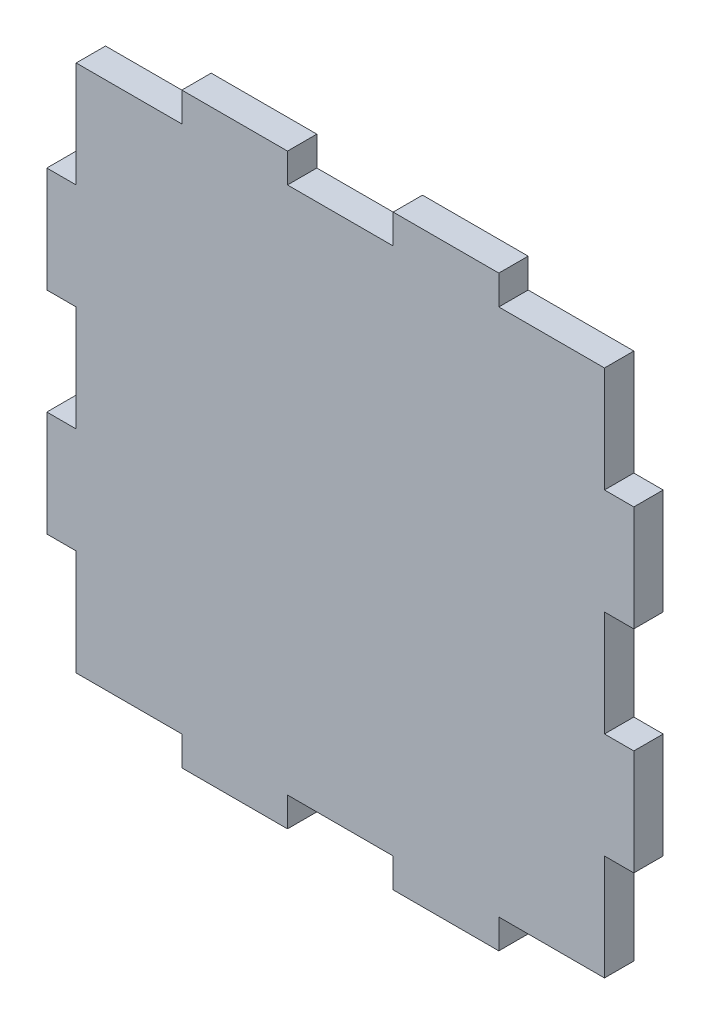
ISO-10303-21;
HEADER;
FILE_DESCRIPTION(('STEP AP214'),'2;1');
FILE_NAME('part.step','',(''),(''),'','','');
FILE_SCHEMA(('AUTOMOTIVE_DESIGN { 1 0 10303 214 1 1 1 1 }'));
ENDSEC;
DATA;
#1=APPLICATION_CONTEXT('core data for automotive mechanical design processes');
#2=APPLICATION_PROTOCOL_DEFINITION('international standard','automotive_design',2000,#1);
#3=PRODUCT_CONTEXT('',#1,'mechanical');
#4=PRODUCT('Part','Part','',(#3));
#5=PRODUCT_RELATED_PRODUCT_CATEGORY('part','',(#4));
#6=PRODUCT_DEFINITION_FORMATION('','',#4);
#7=PRODUCT_DEFINITION_CONTEXT('part definition',#1,'design');
#8=PRODUCT_DEFINITION('design','',#6,#7);
#9=PRODUCT_DEFINITION_SHAPE('','',#8);
#10=(LENGTH_UNIT() NAMED_UNIT(*) SI_UNIT(.MILLI.,.METRE.));
#11=(NAMED_UNIT(*) PLANE_ANGLE_UNIT() SI_UNIT($,.RADIAN.));
#12=(NAMED_UNIT(*) SI_UNIT($,.STERADIAN.) SOLID_ANGLE_UNIT());
#13=UNCERTAINTY_MEASURE_WITH_UNIT(LENGTH_MEASURE(1.E-05),#10,'distance_accuracy_value','');
#14=(GEOMETRIC_REPRESENTATION_CONTEXT(3) GLOBAL_UNCERTAINTY_ASSIGNED_CONTEXT((#13)) GLOBAL_UNIT_ASSIGNED_CONTEXT((#10,
#11,#12)) REPRESENTATION_CONTEXT('',''));
#15=CARTESIAN_POINT('',(0.,0.,0.));
#16=DIRECTION('',(0.,0.,1.));
#17=DIRECTION('',(1.,0.,0.));
#18=AXIS2_PLACEMENT_3D('',#15,#16,#17);
#19=CARTESIAN_POINT('',(0.,-90.,5.));
#20=DIRECTION('',(0.,1.,0.));
#21=DIRECTION('',(0.,0.,1.));
#22=AXIS2_PLACEMENT_3D('',#19,#20,#21);
#23=PLANE('',#22);
#24=DIRECTION('',(1.,0.,0.));
#25=VECTOR('',#24,1.);
#26=CARTESIAN_POINT('',(0.,-90.,5.));
#27=LINE('',#26,#25);
#28=CARTESIAN_POINT('',(-18.,-90.,5.));
#29=VERTEX_POINT('',#28);
#30=CARTESIAN_POINT('',(0.,-90.,5.));
#31=VERTEX_POINT('',#30);
#32=EDGE_CURVE('E48',#29,#31,#27,.T.);
#33=ORIENTED_EDGE('',*,*,#32,.F.);
#34=DIRECTION('',(0.,0.,-1.));
#35=VECTOR('',#34,1.);
#36=CARTESIAN_POINT('',(-18.,-89.9999999999999,5.));
#37=LINE('',#36,#35);
#38=CARTESIAN_POINT('',(-18.,-89.9999999999999,0.));
#39=VERTEX_POINT('',#38);
#40=EDGE_CURVE('E303',#29,#39,#37,.T.);
#41=ORIENTED_EDGE('',*,*,#40,.T.);
#42=DIRECTION('',(1.,0.,0.));
#43=VECTOR('',#42,1.);
#44=CARTESIAN_POINT('',(0.,-90.,0.));
#45=LINE('',#44,#43);
#46=CARTESIAN_POINT('',(0.,-90.,0.));
#47=VERTEX_POINT('',#46);
#48=EDGE_CURVE('E527',#39,#47,#45,.T.);
#49=ORIENTED_EDGE('',*,*,#48,.T.);
#50=DIRECTION('',(0.,0.,-1.));
#51=VECTOR('',#50,1.);
#52=CARTESIAN_POINT('',(0.,-90.,5.));
#53=LINE('',#52,#51);
#54=EDGE_CURVE('E515',#31,#47,#53,.T.);
#55=ORIENTED_EDGE('',*,*,#54,.F.);
#56=EDGE_LOOP('',(#33,#41,#49,#55));
#57=FACE_BOUND('',#56,.T.);
#58=ADVANCED_FACE('F33',(#57),#23,.F.);
#59=DIRECTION('',(0.,0.,-1.));
#60=VECTOR('',#59,1.);
#61=CARTESIAN_POINT('',(-72.,-89.9999999999999,5.));
#62=LINE('',#61,#60);
#63=CARTESIAN_POINT('',(-72.,-89.9999999999999,5.));
#64=VERTEX_POINT('',#63);
#65=CARTESIAN_POINT('',(-72.,-89.9999999999999,0.));
#66=VERTEX_POINT('',#65);
#67=EDGE_CURVE('E329',#64,#66,#62,.T.);
#68=ORIENTED_EDGE('',*,*,#67,.F.);
#69=CARTESIAN_POINT('',(-90.,-90.,5.));
#70=VERTEX_POINT('',#69);
#71=EDGE_CURVE('E512',#70,#64,#27,.T.);
#72=ORIENTED_EDGE('',*,*,#71,.F.);
#73=DIRECTION('',(0.,0.,-1.));
#74=VECTOR('',#73,1.);
#75=CARTESIAN_POINT('',(-90.,-90.,5.));
#76=LINE('',#75,#74);
#77=CARTESIAN_POINT('',(-90.,-90.,0.));
#78=VERTEX_POINT('',#77);
#79=EDGE_CURVE('E535',#70,#78,#76,.T.);
#80=ORIENTED_EDGE('',*,*,#79,.T.);
#81=EDGE_CURVE('E529',#78,#66,#45,.T.);
#82=ORIENTED_EDGE('',*,*,#81,.T.);
#83=EDGE_LOOP('',(#68,#72,#80,#82));
#84=FACE_BOUND('',#83,.T.);
#85=ADVANCED_FACE('F620',(#84),#23,.F.);
#86=CARTESIAN_POINT('',(0.,0.,5.));
#87=DIRECTION('',(0.,-1.,0.));
#88=DIRECTION('',(1.,0.,0.));
#89=AXIS2_PLACEMENT_3D('',#86,#87,#88);
#90=PLANE('',#89);
#91=DIRECTION('',(-1.,0.,0.));
#92=VECTOR('',#91,1.);
#93=CARTESIAN_POINT('',(0.,0.,0.));
#94=LINE('',#93,#92);
#95=CARTESIAN_POINT('',(-36.,0.,0.));
#96=VERTEX_POINT('',#95);
#97=CARTESIAN_POINT('',(-54.,0.,0.));
#98=VERTEX_POINT('',#97);
#99=EDGE_CURVE('E524',#96,#98,#94,.T.);
#100=ORIENTED_EDGE('',*,*,#99,.T.);
#101=DIRECTION('',(0.,0.,-1.));
#102=VECTOR('',#101,1.);
#103=CARTESIAN_POINT('',(-54.,0.,5.));
#104=LINE('',#103,#102);
#105=CARTESIAN_POINT('',(-54.,0.,5.));
#106=VERTEX_POINT('',#105);
#107=EDGE_CURVE('E342',#106,#98,#104,.T.);
#108=ORIENTED_EDGE('',*,*,#107,.F.);
#109=DIRECTION('',(-1.,0.,0.));
#110=VECTOR('',#109,1.);
#111=CARTESIAN_POINT('',(0.,0.,5.));
#112=LINE('',#111,#110);
#113=CARTESIAN_POINT('',(-36.,0.,5.));
#114=VERTEX_POINT('',#113);
#115=EDGE_CURVE('E507',#114,#106,#112,.T.);
#116=ORIENTED_EDGE('',*,*,#115,.F.);
#117=DIRECTION('',(0.,0.,-1.));
#118=VECTOR('',#117,1.);
#119=CARTESIAN_POINT('',(-36.,0.,5.));
#120=LINE('',#119,#118);
#121=EDGE_CURVE('E382',#114,#96,#120,.T.);
#122=ORIENTED_EDGE('',*,*,#121,.T.);
#123=EDGE_LOOP('',(#100,#108,#116,#122));
#124=FACE_BOUND('',#123,.T.);
#125=ADVANCED_FACE('F573',(#124),#90,.F.);
#126=DIRECTION('',(0.,0.,-1.));
#127=VECTOR('',#126,1.);
#128=CARTESIAN_POINT('',(-18.,0.,5.));
#129=LINE('',#128,#127);
#130=CARTESIAN_POINT('',(-18.,0.,5.));
#131=VERTEX_POINT('',#130);
#132=CARTESIAN_POINT('',(-18.,0.,0.));
#133=VERTEX_POINT('',#132);
#134=EDGE_CURVE('E369',#131,#133,#129,.T.);
#135=ORIENTED_EDGE('',*,*,#134,.F.);
#136=CARTESIAN_POINT('',(0.,0.,5.));
#137=VERTEX_POINT('',#136);
#138=EDGE_CURVE('E503',#137,#131,#112,.T.);
#139=ORIENTED_EDGE('',*,*,#138,.F.);
#140=DIRECTION('',(0.,0.,-1.));
#141=VECTOR('',#140,1.);
#142=CARTESIAN_POINT('',(0.,0.,5.));
#143=LINE('',#142,#141);
#144=CARTESIAN_POINT('',(0.,0.,0.));
#145=VERTEX_POINT('',#144);
#146=EDGE_CURVE('E11',#137,#145,#143,.T.);
#147=ORIENTED_EDGE('',*,*,#146,.T.);
#148=EDGE_CURVE('E520',#145,#133,#94,.T.);
#149=ORIENTED_EDGE('',*,*,#148,.T.);
#150=EDGE_LOOP('',(#135,#139,#147,#149));
#151=FACE_BOUND('',#150,.T.);
#152=ADVANCED_FACE('F586',(#151),#90,.F.);
#153=CARTESIAN_POINT('',(-90.,0.,5.));
#154=DIRECTION('',(1.,0.,0.));
#155=DIRECTION('',(0.,0.,-1.));
#156=AXIS2_PLACEMENT_3D('',#153,#154,#155);
#157=PLANE('',#156);
#158=DIRECTION('',(0.,-1.,0.));
#159=VECTOR('',#158,1.);
#160=CARTESIAN_POINT('',(-90.,0.,0.));
#161=LINE('',#160,#159);
#162=CARTESIAN_POINT('',(-90.,0.,0.));
#163=VERTEX_POINT('',#162);
#164=CARTESIAN_POINT('',(-90.,-17.9999999999999,0.));
#165=VERTEX_POINT('',#164);
#166=EDGE_CURVE('E525',#163,#165,#161,.T.);
#167=ORIENTED_EDGE('',*,*,#166,.T.);
#168=DIRECTION('',(0.,0.,-1.));
#169=VECTOR('',#168,1.);
#170=CARTESIAN_POINT('',(-90.,-18.,5.));
#171=LINE('',#170,#169);
#172=CARTESIAN_POINT('',(-90.,-17.9999999999999,5.));
#173=VERTEX_POINT('',#172);
#174=EDGE_CURVE('E396',#173,#165,#171,.T.);
#175=ORIENTED_EDGE('',*,*,#174,.F.);
#176=DIRECTION('',(0.,-1.,0.));
#177=VECTOR('',#176,1.);
#178=CARTESIAN_POINT('',(-90.,0.,5.));
#179=LINE('',#178,#177);
#180=CARTESIAN_POINT('',(-90.,0.,5.));
#181=VERTEX_POINT('',#180);
#182=EDGE_CURVE('E508',#181,#173,#179,.T.);
#183=ORIENTED_EDGE('',*,*,#182,.F.);
#184=DIRECTION('',(0.,0.,-1.));
#185=VECTOR('',#184,1.);
#186=CARTESIAN_POINT('',(-90.,0.,5.));
#187=LINE('',#186,#185);
#188=EDGE_CURVE('E41',#181,#163,#187,.T.);
#189=ORIENTED_EDGE('',*,*,#188,.T.);
#190=EDGE_LOOP('',(#167,#175,#183,#189));
#191=FACE_BOUND('',#190,.T.);
#192=ADVANCED_FACE('F542',(#191),#157,.F.);
#193=CARTESIAN_POINT('',(-90.,-35.9999999999999,5.));
#194=VERTEX_POINT('',#193);
#195=CARTESIAN_POINT('',(-90.,-53.9999999999999,5.));
#196=VERTEX_POINT('',#195);
#197=EDGE_CURVE('E511',#194,#196,#179,.T.);
#198=ORIENTED_EDGE('',*,*,#197,.F.);
#199=DIRECTION('',(0.,0.,-1.));
#200=VECTOR('',#199,1.);
#201=CARTESIAN_POINT('',(-90.,-35.9999999999999,5.));
#202=LINE('',#201,#200);
#203=CARTESIAN_POINT('',(-90.,-35.9999999999999,0.));
#204=VERTEX_POINT('',#203);
#205=EDGE_CURVE('E409',#194,#204,#202,.T.);
#206=ORIENTED_EDGE('',*,*,#205,.T.);
#207=CARTESIAN_POINT('',(-90.,-53.9999999999999,0.));
#208=VERTEX_POINT('',#207);
#209=EDGE_CURVE('E528',#204,#208,#161,.T.);
#210=ORIENTED_EDGE('',*,*,#209,.T.);
#211=DIRECTION('',(0.,0.,-1.));
#212=VECTOR('',#211,1.);
#213=CARTESIAN_POINT('',(-90.,-53.9999999999999,5.));
#214=LINE('',#213,#212);
#215=EDGE_CURVE('E424',#196,#208,#214,.T.);
#216=ORIENTED_EDGE('',*,*,#215,.F.);
#217=EDGE_LOOP('',(#198,#206,#210,#216));
#218=FACE_BOUND('',#217,.T.);
#219=ADVANCED_FACE('F640',(#218),#157,.F.);
#220=CARTESIAN_POINT('',(0.,0.,5.));
#221=DIRECTION('',(-1.,0.,0.));
#222=DIRECTION('',(0.,0.,1.));
#223=AXIS2_PLACEMENT_3D('',#220,#221,#222);
#224=PLANE('',#223);
#225=DIRECTION('',(0.,1.,0.));
#226=VECTOR('',#225,1.);
#227=CARTESIAN_POINT('',(0.,0.,5.));
#228=LINE('',#227,#226);
#229=CARTESIAN_POINT('',(0.,-54.,5.));
#230=VERTEX_POINT('',#229);
#231=CARTESIAN_POINT('',(0.,-36.,5.));
#232=VERTEX_POINT('',#231);
#233=EDGE_CURVE('E501',#230,#232,#228,.T.);
#234=ORIENTED_EDGE('',*,*,#233,.F.);
#235=DIRECTION('',(0.,0.,-1.));
#236=VECTOR('',#235,1.);
#237=CARTESIAN_POINT('',(0.,-54.,5.));
#238=LINE('',#237,#236);
#239=CARTESIAN_POINT('',(0.,-54.,0.));
#240=VERTEX_POINT('',#239);
#241=EDGE_CURVE('E463',#230,#240,#238,.T.);
#242=ORIENTED_EDGE('',*,*,#241,.T.);
#243=DIRECTION('',(0.,1.,0.));
#244=VECTOR('',#243,1.);
#245=CARTESIAN_POINT('',(0.,0.,0.));
#246=LINE('',#245,#244);
#247=CARTESIAN_POINT('',(0.,-36.,0.));
#248=VERTEX_POINT('',#247);
#249=EDGE_CURVE('E519',#240,#248,#246,.T.);
#250=ORIENTED_EDGE('',*,*,#249,.T.);
#251=DIRECTION('',(0.,0.,-1.));
#252=VECTOR('',#251,1.);
#253=CARTESIAN_POINT('',(0.,-36.,5.));
#254=LINE('',#253,#252);
#255=EDGE_CURVE('E494',#232,#248,#254,.T.);
#256=ORIENTED_EDGE('',*,*,#255,.F.);
#257=EDGE_LOOP('',(#234,#242,#250,#256));
#258=FACE_BOUND('',#257,.T.);
#259=ADVANCED_FACE('F593',(#258),#224,.F.);
#260=CARTESIAN_POINT('',(0.,-72.,0.));
#261=VERTEX_POINT('',#260);
#262=EDGE_CURVE('E516',#47,#261,#246,.T.);
#263=ORIENTED_EDGE('',*,*,#262,.T.);
#264=DIRECTION('',(0.,0.,-1.));
#265=VECTOR('',#264,1.);
#266=CARTESIAN_POINT('',(0.,-72.,5.));
#267=LINE('',#266,#265);
#268=CARTESIAN_POINT('',(0.,-72.,5.));
#269=VERTEX_POINT('',#268);
#270=EDGE_CURVE('E466',#269,#261,#267,.T.);
#271=ORIENTED_EDGE('',*,*,#270,.F.);
#272=EDGE_CURVE('E498',#31,#269,#228,.T.);
#273=ORIENTED_EDGE('',*,*,#272,.F.);
#274=ORIENTED_EDGE('',*,*,#54,.T.);
#275=EDGE_LOOP('',(#263,#271,#273,#274));
#276=FACE_BOUND('',#275,.T.);
#277=ADVANCED_FACE('F648',(#276),#224,.F.);
#278=CARTESIAN_POINT('',(0.,-18.,5.));
#279=VERTEX_POINT('',#278);
#280=EDGE_CURVE('E502',#279,#137,#228,.T.);
#281=ORIENTED_EDGE('',*,*,#280,.F.);
#282=DIRECTION('',(0.,0.,-1.));
#283=VECTOR('',#282,1.);
#284=CARTESIAN_POINT('',(0.,-18.,5.));
#285=LINE('',#284,#283);
#286=CARTESIAN_POINT('',(0.,-18.,0.));
#287=VERTEX_POINT('',#286);
#288=EDGE_CURVE('E491',#279,#287,#285,.T.);
#289=ORIENTED_EDGE('',*,*,#288,.T.);
#290=EDGE_CURVE('E490',#287,#145,#246,.T.);
#291=ORIENTED_EDGE('',*,*,#290,.T.);
#292=ORIENTED_EDGE('',*,*,#146,.F.);
#293=EDGE_LOOP('',(#281,#289,#291,#292));
#294=FACE_BOUND('',#293,.T.);
#295=ADVANCED_FACE('F35',(#294),#224,.F.);
#296=CARTESIAN_POINT('',(-72.,0.,5.));
#297=VERTEX_POINT('',#296);
#298=EDGE_CURVE('E500',#297,#181,#112,.T.);
#299=ORIENTED_EDGE('',*,*,#298,.F.);
#300=DIRECTION('',(0.,0.,-1.));
#301=VECTOR('',#300,1.);
#302=CARTESIAN_POINT('',(-72.,0.,5.));
#303=LINE('',#302,#301);
#304=CARTESIAN_POINT('',(-72.,0.,0.));
#305=VERTEX_POINT('',#304);
#306=EDGE_CURVE('E355',#297,#305,#303,.T.);
#307=ORIENTED_EDGE('',*,*,#306,.T.);
#308=EDGE_CURVE('E518',#305,#163,#94,.T.);
#309=ORIENTED_EDGE('',*,*,#308,.T.);
#310=ORIENTED_EDGE('',*,*,#188,.F.);
#311=EDGE_LOOP('',(#299,#307,#309,#310));
#312=FACE_BOUND('',#311,.T.);
#313=ADVANCED_FACE('F571',(#312),#90,.F.);
#314=CARTESIAN_POINT('',(-90.,-71.9999999999999,5.));
#315=VERTEX_POINT('',#314);
#316=EDGE_CURVE('E506',#315,#70,#179,.T.);
#317=ORIENTED_EDGE('',*,*,#316,.F.);
#318=DIRECTION('',(0.,0.,-1.));
#319=VECTOR('',#318,1.);
#320=CARTESIAN_POINT('',(-90.,-71.9999999999999,5.));
#321=LINE('',#320,#319);
#322=CARTESIAN_POINT('',(-90.,-71.9999999999999,0.));
#323=VERTEX_POINT('',#322);
#324=EDGE_CURVE('E437',#315,#323,#321,.T.);
#325=ORIENTED_EDGE('',*,*,#324,.T.);
#326=EDGE_CURVE('E523',#323,#78,#161,.T.);
#327=ORIENTED_EDGE('',*,*,#326,.T.);
#328=ORIENTED_EDGE('',*,*,#79,.F.);
#329=EDGE_LOOP('',(#317,#325,#327,#328));
#330=FACE_BOUND('',#329,.T.);
#331=ADVANCED_FACE('F631',(#330),#157,.F.);
#332=CARTESIAN_POINT('',(-54.,-90.,0.));
#333=VERTEX_POINT('',#332);
#334=CARTESIAN_POINT('',(-36.,-90.,0.));
#335=VERTEX_POINT('',#334);
#336=EDGE_CURVE('E532',#333,#335,#45,.T.);
#337=ORIENTED_EDGE('',*,*,#336,.T.);
#338=DIRECTION('',(0.,0.,-1.));
#339=VECTOR('',#338,1.);
#340=CARTESIAN_POINT('',(-36.,-89.9999999999999,5.));
#341=LINE('',#340,#339);
#342=CARTESIAN_POINT('',(-36.,-90.,5.));
#343=VERTEX_POINT('',#342);
#344=EDGE_CURVE('E56',#343,#335,#341,.T.);
#345=ORIENTED_EDGE('',*,*,#344,.F.);
#346=CARTESIAN_POINT('',(-54.,-89.9999999999999,5.));
#347=VERTEX_POINT('',#346);
#348=EDGE_CURVE('E288',#347,#343,#27,.T.);
#349=ORIENTED_EDGE('',*,*,#348,.F.);
#350=DIRECTION('',(0.,0.,-1.));
#351=VECTOR('',#350,1.);
#352=CARTESIAN_POINT('',(-54.,-89.9999999999999,5.));
#353=LINE('',#352,#351);
#354=EDGE_CURVE('E326',#347,#333,#353,.T.);
#355=ORIENTED_EDGE('',*,*,#354,.T.);
#356=EDGE_LOOP('',(#337,#345,#349,#355));
#357=FACE_BOUND('',#356,.T.);
#358=ADVANCED_FACE('F622',(#357),#23,.F.);
#359=CARTESIAN_POINT('',(0.,0.,5.));
#360=DIRECTION('',(0.,0.,-1.));
#361=DIRECTION('',(-1.,0.,0.));
#362=AXIS2_PLACEMENT_3D('',#359,#360,#361);
#363=PLANE('',#362);
#364=ORIENTED_EDGE('',*,*,#272,.T.);
#365=DIRECTION('',(-1.,0.,0.));
#366=VECTOR('',#365,1.);
#367=CARTESIAN_POINT('',(5.00000000000035,-72.,5.));
#368=LINE('',#367,#366);
#369=CARTESIAN_POINT('',(5.00000000000035,-72.,5.));
#370=VERTEX_POINT('',#369);
#371=EDGE_CURVE('E445',#370,#269,#368,.T.);
#372=ORIENTED_EDGE('',*,*,#371,.F.);
#373=DIRECTION('',(0.,-1.,0.));
#374=VECTOR('',#373,1.);
#375=CARTESIAN_POINT('',(5.00000000000035,-54.,5.));
#376=LINE('',#375,#374);
#377=CARTESIAN_POINT('',(5.00000000000035,-54.,5.));
#378=VERTEX_POINT('',#377);
#379=EDGE_CURVE('E442',#378,#370,#376,.T.);
#380=ORIENTED_EDGE('',*,*,#379,.F.);
#381=DIRECTION('',(1.,0.,0.));
#382=VECTOR('',#381,1.);
#383=CARTESIAN_POINT('',(5.00000000000035,-54.,5.));
#384=LINE('',#383,#382);
#385=EDGE_CURVE('E449',#230,#378,#384,.T.);
#386=ORIENTED_EDGE('',*,*,#385,.F.);
#387=ORIENTED_EDGE('',*,*,#233,.T.);
#388=DIRECTION('',(-1.,0.,0.));
#389=VECTOR('',#388,1.);
#390=CARTESIAN_POINT('',(5.00000000000035,-36.,5.));
#391=LINE('',#390,#389);
#392=CARTESIAN_POINT('',(5.00000000000035,-36.,5.));
#393=VERTEX_POINT('',#392);
#394=EDGE_CURVE('E473',#393,#232,#391,.T.);
#395=ORIENTED_EDGE('',*,*,#394,.F.);
#396=DIRECTION('',(0.,-1.,0.));
#397=VECTOR('',#396,1.);
#398=CARTESIAN_POINT('',(5.00000000000035,-18.,5.));
#399=LINE('',#398,#397);
#400=CARTESIAN_POINT('',(5.00000000000035,-18.,5.));
#401=VERTEX_POINT('',#400);
#402=EDGE_CURVE('E470',#401,#393,#399,.T.);
#403=ORIENTED_EDGE('',*,*,#402,.F.);
#404=DIRECTION('',(1.,0.,0.));
#405=VECTOR('',#404,1.);
#406=CARTESIAN_POINT('',(5.00000000000035,-18.,5.));
#407=LINE('',#406,#405);
#408=EDGE_CURVE('E477',#279,#401,#407,.T.);
#409=ORIENTED_EDGE('',*,*,#408,.F.);
#410=ORIENTED_EDGE('',*,*,#280,.T.);
#411=ORIENTED_EDGE('',*,*,#138,.T.);
#412=DIRECTION('',(0.,-1.,0.));
#413=VECTOR('',#412,1.);
#414=CARTESIAN_POINT('',(-18.,5.00000000000001,5.));
#415=LINE('',#414,#413);
#416=CARTESIAN_POINT('',(-18.,5.00000000000001,5.));
#417=VERTEX_POINT('',#416);
#418=EDGE_CURVE('E360',#417,#131,#415,.T.);
#419=ORIENTED_EDGE('',*,*,#418,.F.);
#420=DIRECTION('',(1.,0.,0.));
#421=VECTOR('',#420,1.);
#422=CARTESIAN_POINT('',(-18.,5.00000000000001,5.));
#423=LINE('',#422,#421);
#424=CARTESIAN_POINT('',(-36.,5.00000000000001,5.));
#425=VERTEX_POINT('',#424);
#426=EDGE_CURVE('E366',#425,#417,#423,.T.);
#427=ORIENTED_EDGE('',*,*,#426,.F.);
#428=DIRECTION('',(0.,1.,0.));
#429=VECTOR('',#428,1.);
#430=CARTESIAN_POINT('',(-36.,5.00000000000001,5.));
#431=LINE('',#430,#429);
#432=EDGE_CURVE('E362',#114,#425,#431,.T.);
#433=ORIENTED_EDGE('',*,*,#432,.F.);
#434=ORIENTED_EDGE('',*,*,#115,.T.);
#435=DIRECTION('',(0.,-1.,0.));
#436=VECTOR('',#435,1.);
#437=CARTESIAN_POINT('',(-54.,5.00000000000001,5.));
#438=LINE('',#437,#436);
#439=CARTESIAN_POINT('',(-54.,5.00000000000001,5.));
#440=VERTEX_POINT('',#439);
#441=EDGE_CURVE('E332',#440,#106,#438,.T.);
#442=ORIENTED_EDGE('',*,*,#441,.F.);
#443=DIRECTION('',(1.,0.,0.));
#444=VECTOR('',#443,1.);
#445=CARTESIAN_POINT('',(-54.,5.00000000000001,5.));
#446=LINE('',#445,#444);
#447=CARTESIAN_POINT('',(-72.,5.00000000000001,5.));
#448=VERTEX_POINT('',#447);
#449=EDGE_CURVE('E339',#448,#440,#446,.T.);
#450=ORIENTED_EDGE('',*,*,#449,.F.);
#451=DIRECTION('',(0.,1.,0.));
#452=VECTOR('',#451,1.);
#453=CARTESIAN_POINT('',(-72.,5.00000000000001,5.));
#454=LINE('',#453,#452);
#455=EDGE_CURVE('E335',#297,#448,#454,.T.);
#456=ORIENTED_EDGE('',*,*,#455,.F.);
#457=ORIENTED_EDGE('',*,*,#298,.T.);
#458=ORIENTED_EDGE('',*,*,#182,.T.);
#459=DIRECTION('',(1.,0.,0.));
#460=VECTOR('',#459,1.);
#461=CARTESIAN_POINT('',(-95.0000000000003,-18.,5.));
#462=LINE('',#461,#460);
#463=CARTESIAN_POINT('',(-95.0000000000003,-18.,5.));
#464=VERTEX_POINT('',#463);
#465=EDGE_CURVE('E386',#464,#173,#462,.T.);
#466=ORIENTED_EDGE('',*,*,#465,.F.);
#467=DIRECTION('',(0.,1.,0.));
#468=VECTOR('',#467,1.);
#469=CARTESIAN_POINT('',(-95.0000000000003,-18.,5.));
#470=LINE('',#469,#468);
#471=CARTESIAN_POINT('',(-95.0000000000003,-35.9999999999999,5.));
#472=VERTEX_POINT('',#471);
#473=EDGE_CURVE('E393',#472,#464,#470,.T.);
#474=ORIENTED_EDGE('',*,*,#473,.F.);
#475=DIRECTION('',(-1.,0.,0.));
#476=VECTOR('',#475,1.);
#477=CARTESIAN_POINT('',(-95.0000000000003,-35.9999999999999,5.));
#478=LINE('',#477,#476);
#479=EDGE_CURVE('E389',#194,#472,#478,.T.);
#480=ORIENTED_EDGE('',*,*,#479,.F.);
#481=ORIENTED_EDGE('',*,*,#197,.T.);
#482=DIRECTION('',(1.,0.,0.));
#483=VECTOR('',#482,1.);
#484=CARTESIAN_POINT('',(-95.0000000000003,-53.9999999999999,5.));
#485=LINE('',#484,#483);
#486=CARTESIAN_POINT('',(-95.0000000000003,-53.9999999999999,5.));
#487=VERTEX_POINT('',#486);
#488=EDGE_CURVE('E414',#487,#196,#485,.T.);
#489=ORIENTED_EDGE('',*,*,#488,.F.);
#490=DIRECTION('',(0.,1.,0.));
#491=VECTOR('',#490,1.);
#492=CARTESIAN_POINT('',(-95.0000000000003,-53.9999999999999,5.));
#493=LINE('',#492,#491);
#494=CARTESIAN_POINT('',(-95.0000000000004,-71.9999999999999,5.));
#495=VERTEX_POINT('',#494);
#496=EDGE_CURVE('E421',#495,#487,#493,.T.);
#497=ORIENTED_EDGE('',*,*,#496,.F.);
#498=DIRECTION('',(-1.,0.,0.));
#499=VECTOR('',#498,1.);
#500=CARTESIAN_POINT('',(-95.0000000000004,-71.9999999999999,5.));
#501=LINE('',#500,#499);
#502=EDGE_CURVE('E417',#315,#495,#501,.T.);
#503=ORIENTED_EDGE('',*,*,#502,.F.);
#504=ORIENTED_EDGE('',*,*,#316,.T.);
#505=ORIENTED_EDGE('',*,*,#71,.T.);
#506=DIRECTION('',(0.,1.,0.));
#507=VECTOR('',#506,1.);
#508=CARTESIAN_POINT('',(-72.,-94.9999999999999,5.));
#509=LINE('',#508,#507);
#510=CARTESIAN_POINT('',(-72.,-94.9999999999999,5.));
#511=VERTEX_POINT('',#510);
#512=EDGE_CURVE('E309',#511,#64,#509,.T.);
#513=ORIENTED_EDGE('',*,*,#512,.F.);
#514=DIRECTION('',(-1.,0.,0.));
#515=VECTOR('',#514,1.);
#516=CARTESIAN_POINT('',(-54.,-94.9999999999999,5.));
#517=LINE('',#516,#515);
#518=CARTESIAN_POINT('',(-54.,-94.9999999999999,5.));
#519=VERTEX_POINT('',#518);
#520=EDGE_CURVE('E306',#519,#511,#517,.T.);
#521=ORIENTED_EDGE('',*,*,#520,.F.);
#522=DIRECTION('',(0.,-1.,0.));
#523=VECTOR('',#522,1.);
#524=CARTESIAN_POINT('',(-54.,-94.9999999999999,5.));
#525=LINE('',#524,#523);
#526=EDGE_CURVE('E312',#347,#519,#525,.T.);
#527=ORIENTED_EDGE('',*,*,#526,.F.);
#528=ORIENTED_EDGE('',*,*,#348,.T.);
#529=DIRECTION('',(0.,1.,0.));
#530=VECTOR('',#529,1.);
#531=CARTESIAN_POINT('',(-36.,-94.9999999999999,5.));
#532=LINE('',#531,#530);
#533=CARTESIAN_POINT('',(-36.,-94.9999999999999,5.));
#534=VERTEX_POINT('',#533);
#535=EDGE_CURVE('E271',#534,#343,#532,.T.);
#536=ORIENTED_EDGE('',*,*,#535,.F.);
#537=DIRECTION('',(-1.,0.,0.));
#538=VECTOR('',#537,1.);
#539=CARTESIAN_POINT('',(-18.,-94.9999999999999,5.));
#540=LINE('',#539,#538);
#541=CARTESIAN_POINT('',(-18.,-94.9999999999999,5.));
#542=VERTEX_POINT('',#541);
#543=EDGE_CURVE('E285',#542,#534,#540,.T.);
#544=ORIENTED_EDGE('',*,*,#543,.F.);
#545=DIRECTION('',(0.,-1.,0.));
#546=VECTOR('',#545,1.);
#547=CARTESIAN_POINT('',(-18.,-94.9999999999999,5.));
#548=LINE('',#547,#546);
#549=EDGE_CURVE('E278',#29,#542,#548,.T.);
#550=ORIENTED_EDGE('',*,*,#549,.F.);
#551=ORIENTED_EDGE('',*,*,#32,.T.);
#552=EDGE_LOOP('',(#364,#372,#380,#386,#387,#395,#403,#409,#410,#411,#419,#427,#433,#434,#442,
#450,#456,#457,#458,#466,#474,#480,#481,#489,#497,#503,#504,#505,#513,#521,#527,#528,#536,#544,
#550,#551));
#553=FACE_BOUND('',#552,.T.);
#554=ADVANCED_FACE('F283',(#553),#363,.F.);
#555=CARTESIAN_POINT('',(0.,0.,0.));
#556=DIRECTION('',(0.,0.,-1.));
#557=DIRECTION('',(-1.,0.,0.));
#558=AXIS2_PLACEMENT_3D('',#555,#556,#557);
#559=PLANE('',#558);
#560=ORIENTED_EDGE('',*,*,#262,.F.);
#561=ORIENTED_EDGE('',*,*,#48,.F.);
#562=DIRECTION('',(0.,-1.,0.));
#563=VECTOR('',#562,1.);
#564=CARTESIAN_POINT('',(-18.,-94.9999999999999,0.));
#565=LINE('',#564,#563);
#566=CARTESIAN_POINT('',(-18.,-94.9999999999999,0.));
#567=VERTEX_POINT('',#566);
#568=EDGE_CURVE('E292',#39,#567,#565,.T.);
#569=ORIENTED_EDGE('',*,*,#568,.T.);
#570=DIRECTION('',(-1.,0.,0.));
#571=VECTOR('',#570,1.);
#572=CARTESIAN_POINT('',(-18.,-94.9999999999999,0.));
#573=LINE('',#572,#571);
#574=CARTESIAN_POINT('',(-36.,-94.9999999999999,0.));
#575=VERTEX_POINT('',#574);
#576=EDGE_CURVE('E298',#567,#575,#573,.T.);
#577=ORIENTED_EDGE('',*,*,#576,.T.);
#578=DIRECTION('',(0.,1.,0.));
#579=VECTOR('',#578,1.);
#580=CARTESIAN_POINT('',(-36.,-94.9999999999999,0.));
#581=LINE('',#580,#579);
#582=EDGE_CURVE('E273',#575,#335,#581,.T.);
#583=ORIENTED_EDGE('',*,*,#582,.T.);
#584=ORIENTED_EDGE('',*,*,#336,.F.);
#585=DIRECTION('',(0.,-1.,0.));
#586=VECTOR('',#585,1.);
#587=CARTESIAN_POINT('',(-54.,-94.9999999999999,0.));
#588=LINE('',#587,#586);
#589=CARTESIAN_POINT('',(-54.,-94.9999999999999,0.));
#590=VERTEX_POINT('',#589);
#591=EDGE_CURVE('E310',#333,#590,#588,.T.);
#592=ORIENTED_EDGE('',*,*,#591,.T.);
#593=DIRECTION('',(-1.,0.,0.));
#594=VECTOR('',#593,1.);
#595=CARTESIAN_POINT('',(-54.,-94.9999999999999,0.));
#596=LINE('',#595,#594);
#597=CARTESIAN_POINT('',(-72.,-94.9999999999999,0.));
#598=VERTEX_POINT('',#597);
#599=EDGE_CURVE('E302',#590,#598,#596,.T.);
#600=ORIENTED_EDGE('',*,*,#599,.T.);
#601=DIRECTION('',(0.,1.,0.));
#602=VECTOR('',#601,1.);
#603=CARTESIAN_POINT('',(-72.,-94.9999999999999,0.));
#604=LINE('',#603,#602);
#605=EDGE_CURVE('E318',#598,#66,#604,.T.);
#606=ORIENTED_EDGE('',*,*,#605,.T.);
#607=ORIENTED_EDGE('',*,*,#81,.F.);
#608=ORIENTED_EDGE('',*,*,#326,.F.);
#609=DIRECTION('',(-1.,0.,0.));
#610=VECTOR('',#609,1.);
#611=CARTESIAN_POINT('',(-95.0000000000004,-71.9999999999999,0.));
#612=LINE('',#611,#610);
#613=CARTESIAN_POINT('',(-95.0000000000004,-71.9999999999999,0.));
#614=VERTEX_POINT('',#613);
#615=EDGE_CURVE('E427',#323,#614,#612,.T.);
#616=ORIENTED_EDGE('',*,*,#615,.T.);
#617=DIRECTION('',(0.,1.,0.));
#618=VECTOR('',#617,1.);
#619=CARTESIAN_POINT('',(-95.0000000000003,-53.9999999999999,0.));
#620=LINE('',#619,#618);
#621=CARTESIAN_POINT('',(-95.0000000000003,-53.9999999999999,0.));
#622=VERTEX_POINT('',#621);
#623=EDGE_CURVE('E418',#614,#622,#620,.T.);
#624=ORIENTED_EDGE('',*,*,#623,.T.);
#625=DIRECTION('',(1.,0.,0.));
#626=VECTOR('',#625,1.);
#627=CARTESIAN_POINT('',(-95.0000000000003,-53.9999999999999,0.));
#628=LINE('',#627,#626);
#629=EDGE_CURVE('E406',#622,#208,#628,.T.);
#630=ORIENTED_EDGE('',*,*,#629,.T.);
#631=ORIENTED_EDGE('',*,*,#209,.F.);
#632=DIRECTION('',(-1.,0.,0.));
#633=VECTOR('',#632,1.);
#634=CARTESIAN_POINT('',(-95.0000000000003,-35.9999999999999,0.));
#635=LINE('',#634,#633);
#636=CARTESIAN_POINT('',(-95.0000000000003,-35.9999999999999,0.));
#637=VERTEX_POINT('',#636);
#638=EDGE_CURVE('E399',#204,#637,#635,.T.);
#639=ORIENTED_EDGE('',*,*,#638,.T.);
#640=DIRECTION('',(0.,1.,0.));
#641=VECTOR('',#640,1.);
#642=CARTESIAN_POINT('',(-95.0000000000003,-18.,0.));
#643=LINE('',#642,#641);
#644=CARTESIAN_POINT('',(-95.0000000000003,-18.,0.));
#645=VERTEX_POINT('',#644);
#646=EDGE_CURVE('E390',#637,#645,#643,.T.);
#647=ORIENTED_EDGE('',*,*,#646,.T.);
#648=DIRECTION('',(1.,0.,0.));
#649=VECTOR('',#648,1.);
#650=CARTESIAN_POINT('',(-95.0000000000003,-18.,0.));
#651=LINE('',#650,#649);
#652=EDGE_CURVE('E379',#645,#165,#651,.T.);
#653=ORIENTED_EDGE('',*,*,#652,.T.);
#654=ORIENTED_EDGE('',*,*,#166,.F.);
#655=ORIENTED_EDGE('',*,*,#308,.F.);
#656=DIRECTION('',(0.,1.,0.));
#657=VECTOR('',#656,1.);
#658=CARTESIAN_POINT('',(-72.,5.00000000000001,0.));
#659=LINE('',#658,#657);
#660=CARTESIAN_POINT('',(-72.,5.00000000000001,0.));
#661=VERTEX_POINT('',#660);
#662=EDGE_CURVE('E345',#305,#661,#659,.T.);
#663=ORIENTED_EDGE('',*,*,#662,.T.);
#664=DIRECTION('',(1.,0.,0.));
#665=VECTOR('',#664,1.);
#666=CARTESIAN_POINT('',(-54.,5.00000000000001,0.));
#667=LINE('',#666,#665);
#668=CARTESIAN_POINT('',(-54.,5.00000000000001,0.));
#669=VERTEX_POINT('',#668);
#670=EDGE_CURVE('E336',#661,#669,#667,.T.);
#671=ORIENTED_EDGE('',*,*,#670,.T.);
#672=DIRECTION('',(0.,-1.,0.));
#673=VECTOR('',#672,1.);
#674=CARTESIAN_POINT('',(-54.,5.00000000000001,0.));
#675=LINE('',#674,#673);
#676=EDGE_CURVE('E325',#669,#98,#675,.T.);
#677=ORIENTED_EDGE('',*,*,#676,.T.);
#678=ORIENTED_EDGE('',*,*,#99,.F.);
#679=DIRECTION('',(0.,1.,0.));
#680=VECTOR('',#679,1.);
#681=CARTESIAN_POINT('',(-36.,5.00000000000001,0.));
#682=LINE('',#681,#680);
#683=CARTESIAN_POINT('',(-36.,5.00000000000001,0.));
#684=VERTEX_POINT('',#683);
#685=EDGE_CURVE('E372',#96,#684,#682,.T.);
#686=ORIENTED_EDGE('',*,*,#685,.T.);
#687=DIRECTION('',(1.,0.,0.));
#688=VECTOR('',#687,1.);
#689=CARTESIAN_POINT('',(-18.,5.00000000000001,0.));
#690=LINE('',#689,#688);
#691=CARTESIAN_POINT('',(-18.,5.00000000000001,0.));
#692=VERTEX_POINT('',#691);
#693=EDGE_CURVE('E363',#684,#692,#690,.T.);
#694=ORIENTED_EDGE('',*,*,#693,.T.);
#695=DIRECTION('',(0.,-1.,0.));
#696=VECTOR('',#695,1.);
#697=CARTESIAN_POINT('',(-18.,5.00000000000001,0.));
#698=LINE('',#697,#696);
#699=EDGE_CURVE('E352',#692,#133,#698,.T.);
#700=ORIENTED_EDGE('',*,*,#699,.T.);
#701=ORIENTED_EDGE('',*,*,#148,.F.);
#702=ORIENTED_EDGE('',*,*,#290,.F.);
#703=DIRECTION('',(1.,0.,0.));
#704=VECTOR('',#703,1.);
#705=CARTESIAN_POINT('',(5.00000000000035,-18.,0.));
#706=LINE('',#705,#704);
#707=CARTESIAN_POINT('',(5.00000000000035,-18.,0.));
#708=VERTEX_POINT('',#707);
#709=EDGE_CURVE('E474',#287,#708,#706,.T.);
#710=ORIENTED_EDGE('',*,*,#709,.T.);
#711=DIRECTION('',(0.,-1.,0.));
#712=VECTOR('',#711,1.);
#713=CARTESIAN_POINT('',(5.00000000000035,-18.,0.));
#714=LINE('',#713,#712);
#715=CARTESIAN_POINT('',(5.00000000000035,-36.,0.));
#716=VERTEX_POINT('',#715);
#717=EDGE_CURVE('E462',#708,#716,#714,.T.);
#718=ORIENTED_EDGE('',*,*,#717,.T.);
#719=DIRECTION('',(-1.,0.,0.));
#720=VECTOR('',#719,1.);
#721=CARTESIAN_POINT('',(5.00000000000035,-36.,0.));
#722=LINE('',#721,#720);
#723=EDGE_CURVE('E483',#716,#248,#722,.T.);
#724=ORIENTED_EDGE('',*,*,#723,.T.);
#725=ORIENTED_EDGE('',*,*,#249,.F.);
#726=DIRECTION('',(1.,0.,0.));
#727=VECTOR('',#726,1.);
#728=CARTESIAN_POINT('',(5.00000000000035,-54.,0.));
#729=LINE('',#728,#727);
#730=CARTESIAN_POINT('',(5.00000000000035,-54.,0.));
#731=VERTEX_POINT('',#730);
#732=EDGE_CURVE('E446',#240,#731,#729,.T.);
#733=ORIENTED_EDGE('',*,*,#732,.T.);
#734=DIRECTION('',(0.,-1.,0.));
#735=VECTOR('',#734,1.);
#736=CARTESIAN_POINT('',(5.00000000000035,-54.,0.));
#737=LINE('',#736,#735);
#738=CARTESIAN_POINT('',(5.00000000000035,-72.,0.));
#739=VERTEX_POINT('',#738);
#740=EDGE_CURVE('E434',#731,#739,#737,.T.);
#741=ORIENTED_EDGE('',*,*,#740,.T.);
#742=DIRECTION('',(-1.,0.,0.));
#743=VECTOR('',#742,1.);
#744=CARTESIAN_POINT('',(5.00000000000035,-72.,0.));
#745=LINE('',#744,#743);
#746=EDGE_CURVE('E455',#739,#261,#745,.T.);
#747=ORIENTED_EDGE('',*,*,#746,.T.);
#748=EDGE_LOOP('',(#560,#561,#569,#577,#583,#584,#592,#600,#606,#607,#608,#616,#624,#630,#631,
#639,#647,#653,#654,#655,#663,#671,#677,#678,#686,#694,#700,#701,#702,#710,#718,#724,#725,#733,
#741,#747));
#749=FACE_BOUND('',#748,.T.);
#750=ADVANCED_FACE('F546',(#749),#559,.T.);
#751=CARTESIAN_POINT('',(5.00000000000035,-18.,5.));
#752=DIRECTION('',(1.,0.,0.));
#753=DIRECTION('',(0.,0.,-1.));
#754=AXIS2_PLACEMENT_3D('',#751,#752,#753);
#755=PLANE('',#754);
#756=ORIENTED_EDGE('',*,*,#717,.F.);
#757=DIRECTION('',(0.,0.,-1.));
#758=VECTOR('',#757,1.);
#759=CARTESIAN_POINT('',(5.00000000000035,-18.,5.));
#760=LINE('',#759,#758);
#761=EDGE_CURVE('E488',#401,#708,#760,.T.);
#762=ORIENTED_EDGE('',*,*,#761,.F.);
#763=ORIENTED_EDGE('',*,*,#402,.T.);
#764=DIRECTION('',(0.,0.,-1.));
#765=VECTOR('',#764,1.);
#766=CARTESIAN_POINT('',(5.00000000000035,-36.,5.));
#767=LINE('',#766,#765);
#768=EDGE_CURVE('E480',#393,#716,#767,.T.);
#769=ORIENTED_EDGE('',*,*,#768,.T.);
#770=EDGE_LOOP('',(#756,#762,#763,#769));
#771=FACE_BOUND('',#770,.T.);
#772=ADVANCED_FACE('F602',(#771),#755,.T.);
#773=CARTESIAN_POINT('',(5.00000000000035,-18.,5.));
#774=DIRECTION('',(0.,1.,0.));
#775=DIRECTION('',(0.,0.,1.));
#776=AXIS2_PLACEMENT_3D('',#773,#774,#775);
#777=PLANE('',#776);
#778=ORIENTED_EDGE('',*,*,#709,.F.);
#779=ORIENTED_EDGE('',*,*,#288,.F.);
#780=ORIENTED_EDGE('',*,*,#408,.T.);
#781=ORIENTED_EDGE('',*,*,#761,.T.);
#782=EDGE_LOOP('',(#778,#779,#780,#781));
#783=FACE_BOUND('',#782,.T.);
#784=ADVANCED_FACE('F608',(#783),#777,.T.);
#785=CARTESIAN_POINT('',(5.00000000000035,-36.,5.));
#786=DIRECTION('',(0.,-1.,0.));
#787=DIRECTION('',(0.,0.,-1.));
#788=AXIS2_PLACEMENT_3D('',#785,#786,#787);
#789=PLANE('',#788);
#790=ORIENTED_EDGE('',*,*,#723,.F.);
#791=ORIENTED_EDGE('',*,*,#768,.F.);
#792=ORIENTED_EDGE('',*,*,#394,.T.);
#793=ORIENTED_EDGE('',*,*,#255,.T.);
#794=EDGE_LOOP('',(#790,#791,#792,#793));
#795=FACE_BOUND('',#794,.T.);
#796=ADVANCED_FACE('F598',(#795),#789,.T.);
#797=CARTESIAN_POINT('',(5.00000000000035,-54.,5.));
#798=DIRECTION('',(1.,0.,0.));
#799=DIRECTION('',(0.,0.,-1.));
#800=AXIS2_PLACEMENT_3D('',#797,#798,#799);
#801=PLANE('',#800);
#802=ORIENTED_EDGE('',*,*,#740,.F.);
#803=DIRECTION('',(0.,0.,-1.));
#804=VECTOR('',#803,1.);
#805=CARTESIAN_POINT('',(5.00000000000035,-54.,5.));
#806=LINE('',#805,#804);
#807=EDGE_CURVE('E460',#378,#731,#806,.T.);
#808=ORIENTED_EDGE('',*,*,#807,.F.);
#809=ORIENTED_EDGE('',*,*,#379,.T.);
#810=DIRECTION('',(0.,0.,-1.));
#811=VECTOR('',#810,1.);
#812=CARTESIAN_POINT('',(5.00000000000035,-72.,5.));
#813=LINE('',#812,#811);
#814=EDGE_CURVE('E452',#370,#739,#813,.T.);
#815=ORIENTED_EDGE('',*,*,#814,.T.);
#816=EDGE_LOOP('',(#802,#808,#809,#815));
#817=FACE_BOUND('',#816,.T.);
#818=ADVANCED_FACE('F615',(#817),#801,.T.);
#819=CARTESIAN_POINT('',(5.00000000000035,-54.,5.));
#820=DIRECTION('',(0.,1.,0.));
#821=DIRECTION('',(0.,0.,1.));
#822=AXIS2_PLACEMENT_3D('',#819,#820,#821);
#823=PLANE('',#822);
#824=ORIENTED_EDGE('',*,*,#732,.F.);
#825=ORIENTED_EDGE('',*,*,#241,.F.);
#826=ORIENTED_EDGE('',*,*,#385,.T.);
#827=ORIENTED_EDGE('',*,*,#807,.T.);
#828=EDGE_LOOP('',(#824,#825,#826,#827));
#829=FACE_BOUND('',#828,.T.);
#830=ADVANCED_FACE('F655',(#829),#823,.T.);
#831=CARTESIAN_POINT('',(5.00000000000035,-72.,5.));
#832=DIRECTION('',(0.,-1.,0.));
#833=DIRECTION('',(0.,0.,-1.));
#834=AXIS2_PLACEMENT_3D('',#831,#832,#833);
#835=PLANE('',#834);
#836=ORIENTED_EDGE('',*,*,#746,.F.);
#837=ORIENTED_EDGE('',*,*,#814,.F.);
#838=ORIENTED_EDGE('',*,*,#371,.T.);
#839=ORIENTED_EDGE('',*,*,#270,.T.);
#840=EDGE_LOOP('',(#836,#837,#838,#839));
#841=FACE_BOUND('',#840,.T.);
#842=ADVANCED_FACE('F651',(#841),#835,.T.);
#843=CARTESIAN_POINT('',(-95.0000000000003,-53.9999999999999,5.));
#844=DIRECTION('',(0.,1.,0.));
#845=DIRECTION('',(0.,0.,1.));
#846=AXIS2_PLACEMENT_3D('',#843,#844,#845);
#847=PLANE('',#846);
#848=ORIENTED_EDGE('',*,*,#629,.F.);
#849=DIRECTION('',(0.,0.,-1.));
#850=VECTOR('',#849,1.);
#851=CARTESIAN_POINT('',(-95.0000000000003,-53.9999999999999,5.));
#852=LINE('',#851,#850);
#853=EDGE_CURVE('E432',#487,#622,#852,.T.);
#854=ORIENTED_EDGE('',*,*,#853,.F.);
#855=ORIENTED_EDGE('',*,*,#488,.T.);
#856=ORIENTED_EDGE('',*,*,#215,.T.);
#857=EDGE_LOOP('',(#848,#854,#855,#856));
#858=FACE_BOUND('',#857,.T.);
#859=ADVANCED_FACE('F662',(#858),#847,.T.);
#860=CARTESIAN_POINT('',(-95.0000000000003,-53.9999999999999,5.));
#861=DIRECTION('',(-1.,0.,0.));
#862=DIRECTION('',(0.,-1.,0.));
#863=AXIS2_PLACEMENT_3D('',#860,#861,#862);
#864=PLANE('',#863);
#865=ORIENTED_EDGE('',*,*,#623,.F.);
#866=DIRECTION('',(0.,0.,-1.));
#867=VECTOR('',#866,1.);
#868=CARTESIAN_POINT('',(-95.0000000000004,-71.9999999999999,5.));
#869=LINE('',#868,#867);
#870=EDGE_CURVE('E435',#495,#614,#869,.T.);
#871=ORIENTED_EDGE('',*,*,#870,.F.);
#872=ORIENTED_EDGE('',*,*,#496,.T.);
#873=ORIENTED_EDGE('',*,*,#853,.T.);
#874=EDGE_LOOP('',(#865,#871,#872,#873));
#875=FACE_BOUND('',#874,.T.);
#876=ADVANCED_FACE('F667',(#875),#864,.T.);
#877=CARTESIAN_POINT('',(-95.0000000000004,-71.9999999999999,5.));
#878=DIRECTION('',(0.,-1.,0.));
#879=DIRECTION('',(0.,0.,-1.));
#880=AXIS2_PLACEMENT_3D('',#877,#878,#879);
#881=PLANE('',#880);
#882=ORIENTED_EDGE('',*,*,#615,.F.);
#883=ORIENTED_EDGE('',*,*,#324,.F.);
#884=ORIENTED_EDGE('',*,*,#502,.T.);
#885=ORIENTED_EDGE('',*,*,#870,.T.);
#886=EDGE_LOOP('',(#882,#883,#884,#885));
#887=FACE_BOUND('',#886,.T.);
#888=ADVANCED_FACE('F669',(#887),#881,.T.);
#889=CARTESIAN_POINT('',(-95.0000000000003,-18.,5.));
#890=DIRECTION('',(0.,1.,0.));
#891=DIRECTION('',(0.,0.,1.));
#892=AXIS2_PLACEMENT_3D('',#889,#890,#891);
#893=PLANE('',#892);
#894=ORIENTED_EDGE('',*,*,#652,.F.);
#895=DIRECTION('',(0.,0.,-1.));
#896=VECTOR('',#895,1.);
#897=CARTESIAN_POINT('',(-95.0000000000003,-18.,5.));
#898=LINE('',#897,#896);
#899=EDGE_CURVE('E404',#464,#645,#898,.T.);
#900=ORIENTED_EDGE('',*,*,#899,.F.);
#901=ORIENTED_EDGE('',*,*,#465,.T.);
#902=ORIENTED_EDGE('',*,*,#174,.T.);
#903=EDGE_LOOP('',(#894,#900,#901,#902));
#904=FACE_BOUND('',#903,.T.);
#905=ADVANCED_FACE('F550',(#904),#893,.T.);
#906=CARTESIAN_POINT('',(-95.0000000000003,-18.,5.));
#907=DIRECTION('',(-1.,0.,0.));
#908=DIRECTION('',(0.,-1.,0.));
#909=AXIS2_PLACEMENT_3D('',#906,#907,#908);
#910=PLANE('',#909);
#911=ORIENTED_EDGE('',*,*,#646,.F.);
#912=DIRECTION('',(0.,0.,-1.));
#913=VECTOR('',#912,1.);
#914=CARTESIAN_POINT('',(-95.0000000000003,-35.9999999999999,5.));
#915=LINE('',#914,#913);
#916=EDGE_CURVE('E407',#472,#637,#915,.T.);
#917=ORIENTED_EDGE('',*,*,#916,.F.);
#918=ORIENTED_EDGE('',*,*,#473,.T.);
#919=ORIENTED_EDGE('',*,*,#899,.T.);
#920=EDGE_LOOP('',(#911,#917,#918,#919));
#921=FACE_BOUND('',#920,.T.);
#922=ADVANCED_FACE('F678',(#921),#910,.T.);
#923=CARTESIAN_POINT('',(-95.0000000000003,-35.9999999999999,5.));
#924=DIRECTION('',(0.,-1.,0.));
#925=DIRECTION('',(0.,0.,-1.));
#926=AXIS2_PLACEMENT_3D('',#923,#924,#925);
#927=PLANE('',#926);
#928=ORIENTED_EDGE('',*,*,#638,.F.);
#929=ORIENTED_EDGE('',*,*,#205,.F.);
#930=ORIENTED_EDGE('',*,*,#479,.T.);
#931=ORIENTED_EDGE('',*,*,#916,.T.);
#932=EDGE_LOOP('',(#928,#929,#930,#931));
#933=FACE_BOUND('',#932,.T.);
#934=ADVANCED_FACE('F679',(#933),#927,.T.);
#935=CARTESIAN_POINT('',(-18.,5.00000000000001,5.));
#936=DIRECTION('',(1.,0.,0.));
#937=DIRECTION('',(0.,0.,-1.));
#938=AXIS2_PLACEMENT_3D('',#935,#936,#937);
#939=PLANE('',#938);
#940=ORIENTED_EDGE('',*,*,#699,.F.);
#941=DIRECTION('',(0.,0.,-1.));
#942=VECTOR('',#941,1.);
#943=CARTESIAN_POINT('',(-18.,5.00000000000001,5.));
#944=LINE('',#943,#942);
#945=EDGE_CURVE('E377',#417,#692,#944,.T.);
#946=ORIENTED_EDGE('',*,*,#945,.F.);
#947=ORIENTED_EDGE('',*,*,#418,.T.);
#948=ORIENTED_EDGE('',*,*,#134,.T.);
#949=EDGE_LOOP('',(#940,#946,#947,#948));
#950=FACE_BOUND('',#949,.T.);
#951=ADVANCED_FACE('F581',(#950),#939,.T.);
#952=CARTESIAN_POINT('',(-18.,5.00000000000001,5.));
#953=DIRECTION('',(0.,1.,0.));
#954=DIRECTION('',(-1.,0.,0.));
#955=AXIS2_PLACEMENT_3D('',#952,#953,#954);
#956=PLANE('',#955);
#957=ORIENTED_EDGE('',*,*,#693,.F.);
#958=DIRECTION('',(0.,0.,-1.));
#959=VECTOR('',#958,1.);
#960=CARTESIAN_POINT('',(-36.,5.00000000000001,5.));
#961=LINE('',#960,#959);
#962=EDGE_CURVE('E380',#425,#684,#961,.T.);
#963=ORIENTED_EDGE('',*,*,#962,.F.);
#964=ORIENTED_EDGE('',*,*,#426,.T.);
#965=ORIENTED_EDGE('',*,*,#945,.T.);
#966=EDGE_LOOP('',(#957,#963,#964,#965));
#967=FACE_BOUND('',#966,.T.);
#968=ADVANCED_FACE('F577',(#967),#956,.T.);
#969=CARTESIAN_POINT('',(-36.,5.00000000000001,5.));
#970=DIRECTION('',(-1.,0.,0.));
#971=DIRECTION('',(0.,0.,1.));
#972=AXIS2_PLACEMENT_3D('',#969,#970,#971);
#973=PLANE('',#972);
#974=ORIENTED_EDGE('',*,*,#685,.F.);
#975=ORIENTED_EDGE('',*,*,#121,.F.);
#976=ORIENTED_EDGE('',*,*,#432,.T.);
#977=ORIENTED_EDGE('',*,*,#962,.T.);
#978=EDGE_LOOP('',(#974,#975,#976,#977));
#979=FACE_BOUND('',#978,.T.);
#980=ADVANCED_FACE('F688',(#979),#973,.T.);
#981=CARTESIAN_POINT('',(-54.,5.00000000000001,5.));
#982=DIRECTION('',(1.,0.,0.));
#983=DIRECTION('',(0.,1.,0.));
#984=AXIS2_PLACEMENT_3D('',#981,#982,#983);
#985=PLANE('',#984);
#986=ORIENTED_EDGE('',*,*,#676,.F.);
#987=DIRECTION('',(0.,0.,-1.));
#988=VECTOR('',#987,1.);
#989=CARTESIAN_POINT('',(-54.,5.00000000000001,5.));
#990=LINE('',#989,#988);
#991=EDGE_CURVE('E350',#440,#669,#990,.T.);
#992=ORIENTED_EDGE('',*,*,#991,.F.);
#993=ORIENTED_EDGE('',*,*,#441,.T.);
#994=ORIENTED_EDGE('',*,*,#107,.T.);
#995=EDGE_LOOP('',(#986,#992,#993,#994));
#996=FACE_BOUND('',#995,.T.);
#997=ADVANCED_FACE('F564',(#996),#985,.T.);
#998=CARTESIAN_POINT('',(-54.,5.00000000000001,5.));
#999=DIRECTION('',(0.,1.,0.));
#1000=DIRECTION('',(-1.,0.,0.));
#1001=AXIS2_PLACEMENT_3D('',#998,#999,#1000);
#1002=PLANE('',#1001);
#1003=ORIENTED_EDGE('',*,*,#670,.F.);
#1004=DIRECTION('',(0.,0.,-1.));
#1005=VECTOR('',#1004,1.);
#1006=CARTESIAN_POINT('',(-72.,5.00000000000001,5.));
#1007=LINE('',#1006,#1005);
#1008=EDGE_CURVE('E353',#448,#661,#1007,.T.);
#1009=ORIENTED_EDGE('',*,*,#1008,.F.);
#1010=ORIENTED_EDGE('',*,*,#449,.T.);
#1011=ORIENTED_EDGE('',*,*,#991,.T.);
#1012=EDGE_LOOP('',(#1003,#1009,#1010,#1011));
#1013=FACE_BOUND('',#1012,.T.);
#1014=ADVANCED_FACE('F567',(#1013),#1002,.T.);
#1015=CARTESIAN_POINT('',(-72.,5.00000000000001,5.));
#1016=DIRECTION('',(-1.,0.,0.));
#1017=DIRECTION('',(0.,0.,1.));
#1018=AXIS2_PLACEMENT_3D('',#1015,#1016,#1017);
#1019=PLANE('',#1018);
#1020=ORIENTED_EDGE('',*,*,#662,.F.);
#1021=ORIENTED_EDGE('',*,*,#306,.F.);
#1022=ORIENTED_EDGE('',*,*,#455,.T.);
#1023=ORIENTED_EDGE('',*,*,#1008,.T.);
#1024=EDGE_LOOP('',(#1020,#1021,#1022,#1023));
#1025=FACE_BOUND('',#1024,.T.);
#1026=ADVANCED_FACE('F570',(#1025),#1019,.T.);
#1027=CARTESIAN_POINT('',(-54.,-94.9999999999999,5.));
#1028=DIRECTION('',(0.,-1.,0.));
#1029=DIRECTION('',(1.,0.,0.));
#1030=AXIS2_PLACEMENT_3D('',#1027,#1028,#1029);
#1031=PLANE('',#1030);
#1032=ORIENTED_EDGE('',*,*,#599,.F.);
#1033=DIRECTION('',(0.,0.,-1.));
#1034=VECTOR('',#1033,1.);
#1035=CARTESIAN_POINT('',(-54.,-94.9999999999999,5.));
#1036=LINE('',#1035,#1034);
#1037=EDGE_CURVE('E323',#519,#590,#1036,.T.);
#1038=ORIENTED_EDGE('',*,*,#1037,.F.);
#1039=ORIENTED_EDGE('',*,*,#520,.T.);
#1040=DIRECTION('',(0.,0.,-1.));
#1041=VECTOR('',#1040,1.);
#1042=CARTESIAN_POINT('',(-72.,-94.9999999999999,5.));
#1043=LINE('',#1042,#1041);
#1044=EDGE_CURVE('E315',#511,#598,#1043,.T.);
#1045=ORIENTED_EDGE('',*,*,#1044,.T.);
#1046=EDGE_LOOP('',(#1032,#1038,#1039,#1045));
#1047=FACE_BOUND('',#1046,.T.);
#1048=ADVANCED_FACE('F697',(#1047),#1031,.T.);
#1049=CARTESIAN_POINT('',(-54.,-94.9999999999999,5.));
#1050=DIRECTION('',(1.,0.,0.));
#1051=DIRECTION('',(0.,1.,0.));
#1052=AXIS2_PLACEMENT_3D('',#1049,#1050,#1051);
#1053=PLANE('',#1052);
#1054=ORIENTED_EDGE('',*,*,#591,.F.);
#1055=ORIENTED_EDGE('',*,*,#354,.F.);
#1056=ORIENTED_EDGE('',*,*,#526,.T.);
#1057=ORIENTED_EDGE('',*,*,#1037,.T.);
#1058=EDGE_LOOP('',(#1054,#1055,#1056,#1057));
#1059=FACE_BOUND('',#1058,.T.);
#1060=ADVANCED_FACE('F702',(#1059),#1053,.T.);
#1061=CARTESIAN_POINT('',(-72.,-94.9999999999999,5.));
#1062=DIRECTION('',(-1.,0.,0.));
#1063=DIRECTION('',(0.,0.,1.));
#1064=AXIS2_PLACEMENT_3D('',#1061,#1062,#1063);
#1065=PLANE('',#1064);
#1066=ORIENTED_EDGE('',*,*,#605,.F.);
#1067=ORIENTED_EDGE('',*,*,#1044,.F.);
#1068=ORIENTED_EDGE('',*,*,#512,.T.);
#1069=ORIENTED_EDGE('',*,*,#67,.T.);
#1070=EDGE_LOOP('',(#1066,#1067,#1068,#1069));
#1071=FACE_BOUND('',#1070,.T.);
#1072=ADVANCED_FACE('F704',(#1071),#1065,.T.);
#1073=CARTESIAN_POINT('',(-18.,-94.9999999999999,5.));
#1074=DIRECTION('',(0.,-1.,0.));
#1075=DIRECTION('',(1.,0.,0.));
#1076=AXIS2_PLACEMENT_3D('',#1073,#1074,#1075);
#1077=PLANE('',#1076);
#1078=ORIENTED_EDGE('',*,*,#576,.F.);
#1079=DIRECTION('',(0.,0.,-1.));
#1080=VECTOR('',#1079,1.);
#1081=CARTESIAN_POINT('',(-18.,-94.9999999999999,5.));
#1082=LINE('',#1081,#1080);
#1083=EDGE_CURVE('E291',#542,#567,#1082,.T.);
#1084=ORIENTED_EDGE('',*,*,#1083,.F.);
#1085=ORIENTED_EDGE('',*,*,#543,.T.);
#1086=DIRECTION('',(0.,0.,-1.));
#1087=VECTOR('',#1086,1.);
#1088=CARTESIAN_POINT('',(-36.,-94.9999999999999,5.));
#1089=LINE('',#1088,#1087);
#1090=EDGE_CURVE('E268',#534,#575,#1089,.T.);
#1091=ORIENTED_EDGE('',*,*,#1090,.T.);
#1092=EDGE_LOOP('',(#1078,#1084,#1085,#1091));
#1093=FACE_BOUND('',#1092,.T.);
#1094=ADVANCED_FACE('F290',(#1093),#1077,.T.);
#1095=CARTESIAN_POINT('',(-18.,-94.9999999999999,5.));
#1096=DIRECTION('',(1.,0.,0.));
#1097=DIRECTION('',(0.,1.,0.));
#1098=AXIS2_PLACEMENT_3D('',#1095,#1096,#1097);
#1099=PLANE('',#1098);
#1100=ORIENTED_EDGE('',*,*,#568,.F.);
#1101=ORIENTED_EDGE('',*,*,#40,.F.);
#1102=ORIENTED_EDGE('',*,*,#549,.T.);
#1103=ORIENTED_EDGE('',*,*,#1083,.T.);
#1104=EDGE_LOOP('',(#1100,#1101,#1102,#1103));
#1105=FACE_BOUND('',#1104,.T.);
#1106=ADVANCED_FACE('F644',(#1105),#1099,.T.);
#1107=CARTESIAN_POINT('',(-36.,-94.9999999999999,5.));
#1108=DIRECTION('',(-1.,0.,0.));
#1109=DIRECTION('',(0.,0.,1.));
#1110=AXIS2_PLACEMENT_3D('',#1107,#1108,#1109);
#1111=PLANE('',#1110);
#1112=ORIENTED_EDGE('',*,*,#582,.F.);
#1113=ORIENTED_EDGE('',*,*,#1090,.F.);
#1114=ORIENTED_EDGE('',*,*,#535,.T.);
#1115=ORIENTED_EDGE('',*,*,#344,.T.);
#1116=EDGE_LOOP('',(#1112,#1113,#1114,#1115));
#1117=FACE_BOUND('',#1116,.T.);
#1118=ADVANCED_FACE('F270',(#1117),#1111,.T.);
#1119=CLOSED_SHELL('',(#58,#85,#125,#152,#192,#219,#259,#277,#295,#313,#331,#358,#554,#750,#772,
#784,#796,#818,#830,#842,#859,#876,#888,#905,#922,#934,#951,#968,#980,#997,#1014,#1026,#1048,
#1060,#1072,#1094,#1106,#1118));
#1120=MANIFOLD_SOLID_BREP('B2',#1119);
#1121=ADVANCED_BREP_SHAPE_REPRESENTATION('',(#18,#1120),#14);
#1122=SHAPE_DEFINITION_REPRESENTATION(#9,#1121);
ENDSEC;
END-ISO-10303-21;
